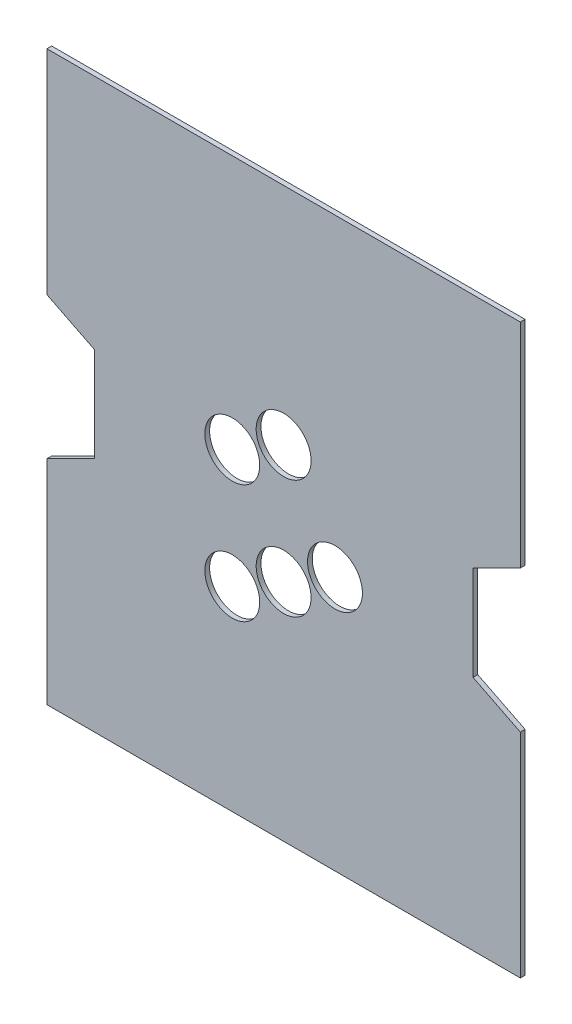
ISO-10303-21;
HEADER;
FILE_DESCRIPTION(('STEP AP214'),'2;1');
FILE_NAME('part.step','',(''),(''),'','','');
FILE_SCHEMA(('AUTOMOTIVE_DESIGN { 1 0 10303 214 1 1 1 1 }'));
ENDSEC;
DATA;
#1=APPLICATION_CONTEXT('core data for automotive mechanical design processes');
#2=APPLICATION_PROTOCOL_DEFINITION('international standard','automotive_design',2000,#1);
#3=PRODUCT_CONTEXT('',#1,'mechanical');
#4=PRODUCT('Part','Part','',(#3));
#5=PRODUCT_RELATED_PRODUCT_CATEGORY('part','',(#4));
#6=PRODUCT_DEFINITION_FORMATION('','',#4);
#7=PRODUCT_DEFINITION_CONTEXT('part definition',#1,'design');
#8=PRODUCT_DEFINITION('design','',#6,#7);
#9=PRODUCT_DEFINITION_SHAPE('','',#8);
#10=(LENGTH_UNIT() NAMED_UNIT(*) SI_UNIT(.MILLI.,.METRE.));
#11=(NAMED_UNIT(*) PLANE_ANGLE_UNIT() SI_UNIT($,.RADIAN.));
#12=(NAMED_UNIT(*) SI_UNIT($,.STERADIAN.) SOLID_ANGLE_UNIT());
#13=UNCERTAINTY_MEASURE_WITH_UNIT(LENGTH_MEASURE(1.E-05),#10,'distance_accuracy_value','');
#14=(GEOMETRIC_REPRESENTATION_CONTEXT(3) GLOBAL_UNCERTAINTY_ASSIGNED_CONTEXT((#13)) GLOBAL_UNIT_ASSIGNED_CONTEXT((#10,
#11,#12)) REPRESENTATION_CONTEXT('',''));
#15=CARTESIAN_POINT('',(0.,0.,0.));
#16=DIRECTION('',(0.,0.,1.));
#17=DIRECTION('',(1.,0.,0.));
#18=AXIS2_PLACEMENT_3D('',#15,#16,#17);
#19=CARTESIAN_POINT('',(0.,0.,0.));
#20=DIRECTION('',(0.,0.,1.));
#21=DIRECTION('',(1.,0.,0.));
#22=AXIS2_PLACEMENT_3D('',#19,#20,#21);
#23=PLANE('',#22);
#24=DIRECTION('',(-0.894427190999915,0.447213595499959,0.));
#25=VECTOR('',#24,1.);
#26=CARTESIAN_POINT('',(20.0000000000002,40.0000000000003,0.));
#27=LINE('',#26,#25);
#28=CARTESIAN_POINT('',(250.,-75.0000000000001,0.));
#29=VERTEX_POINT('',#28);
#30=CARTESIAN_POINT('',(200.,-49.9999999999999,0.));
#31=VERTEX_POINT('',#30);
#32=EDGE_CURVE('E395',#29,#31,#27,.T.);
#33=ORIENTED_EDGE('',*,*,#32,.F.);
#34=DIRECTION('',(0.,1.,0.));
#35=VECTOR('',#34,1.);
#36=CARTESIAN_POINT('',(250.,0.,0.));
#37=LINE('',#36,#35);
#38=CARTESIAN_POINT('',(250.,-300.,0.));
#39=VERTEX_POINT('',#38);
#40=EDGE_CURVE('E397',#29,#39,#37,.F.);
#41=ORIENTED_EDGE('',*,*,#40,.T.);
#42=DIRECTION('',(1.,0.,0.));
#43=VECTOR('',#42,1.);
#44=CARTESIAN_POINT('',(0.,-300.,0.));
#45=LINE('',#44,#43);
#46=CARTESIAN_POINT('',(-250.,-300.,0.));
#47=VERTEX_POINT('',#46);
#48=EDGE_CURVE('E405',#47,#39,#45,.T.);
#49=ORIENTED_EDGE('',*,*,#48,.F.);
#50=DIRECTION('',(0.,1.,0.));
#51=VECTOR('',#50,1.);
#52=CARTESIAN_POINT('',(-250.,0.,0.));
#53=LINE('',#52,#51);
#54=CARTESIAN_POINT('',(-250.,-75.0000000000003,0.));
#55=VERTEX_POINT('',#54);
#56=EDGE_CURVE('E410',#55,#47,#53,.F.);
#57=ORIENTED_EDGE('',*,*,#56,.F.);
#58=DIRECTION('',(0.894427190999915,0.44721359549996,0.));
#59=VECTOR('',#58,1.);
#60=CARTESIAN_POINT('',(-20.0000000000003,40.0000000000004,0.));
#61=LINE('',#60,#59);
#62=CARTESIAN_POINT('',(-200.,-50.,0.));
#63=VERTEX_POINT('',#62);
#64=EDGE_CURVE('E413',#55,#63,#61,.T.);
#65=ORIENTED_EDGE('',*,*,#64,.T.);
#66=DIRECTION('',(0.,-1.,0.));
#67=VECTOR('',#66,1.);
#68=CARTESIAN_POINT('',(-200.,-2.22044604925031E-13,0.));
#69=LINE('',#68,#67);
#70=CARTESIAN_POINT('',(-200.,50.,0.));
#71=VERTEX_POINT('',#70);
#72=EDGE_CURVE('E421',#71,#63,#69,.T.);
#73=ORIENTED_EDGE('',*,*,#72,.F.);
#74=DIRECTION('',(0.894427190999916,-0.447213595499958,0.));
#75=VECTOR('',#74,1.);
#76=CARTESIAN_POINT('',(-20.,-40.,0.));
#77=LINE('',#76,#75);
#78=CARTESIAN_POINT('',(-250.,75.,0.));
#79=VERTEX_POINT('',#78);
#80=EDGE_CURVE('E426',#79,#71,#77,.T.);
#81=ORIENTED_EDGE('',*,*,#80,.F.);
#82=DIRECTION('',(0.,1.,0.));
#83=VECTOR('',#82,1.);
#84=CARTESIAN_POINT('',(-250.,0.,0.));
#85=LINE('',#84,#83);
#86=CARTESIAN_POINT('',(-250.,300.,0.));
#87=VERTEX_POINT('',#86);
#88=EDGE_CURVE('E430',#87,#79,#85,.F.);
#89=ORIENTED_EDGE('',*,*,#88,.F.);
#90=DIRECTION('',(1.,0.,0.));
#91=VECTOR('',#90,1.);
#92=CARTESIAN_POINT('',(0.,300.,0.));
#93=LINE('',#92,#91);
#94=CARTESIAN_POINT('',(250.,300.,0.));
#95=VERTEX_POINT('',#94);
#96=EDGE_CURVE('E378',#87,#95,#93,.T.);
#97=ORIENTED_EDGE('',*,*,#96,.T.);
#98=DIRECTION('',(0.,1.,0.));
#99=VECTOR('',#98,1.);
#100=CARTESIAN_POINT('',(250.,0.,0.));
#101=LINE('',#100,#99);
#102=CARTESIAN_POINT('',(250.,75.,0.));
#103=VERTEX_POINT('',#102);
#104=EDGE_CURVE('E120',#95,#103,#101,.F.);
#105=ORIENTED_EDGE('',*,*,#104,.T.);
#106=DIRECTION('',(-0.894427190999916,-0.447213595499958,0.));
#107=VECTOR('',#106,1.);
#108=CARTESIAN_POINT('',(20.,-40.,0.));
#109=LINE('',#108,#107);
#110=CARTESIAN_POINT('',(200.,50.,0.));
#111=VERTEX_POINT('',#110);
#112=EDGE_CURVE('E103',#103,#111,#109,.T.);
#113=ORIENTED_EDGE('',*,*,#112,.T.);
#114=DIRECTION('',(0.,-1.,0.));
#115=VECTOR('',#114,1.);
#116=CARTESIAN_POINT('',(200.,-2.22044604925031E-13,0.));
#117=LINE('',#116,#115);
#118=EDGE_CURVE('E108',#111,#31,#117,.T.);
#119=ORIENTED_EDGE('',*,*,#118,.T.);
#120=EDGE_LOOP('',(#33,#41,#49,#57,#65,#73,#81,#89,#97,#105,#113,#119));
#121=FACE_BOUND('',#120,.T.);
#122=CARTESIAN_POINT('',(-54.2270338553597,-93.927023337783,0.));
#123=DIRECTION('',(0.,0.,1.));
#124=DIRECTION('',(1.,0.,0.));
#125=AXIS2_PLACEMENT_3D('',#122,#123,#124);
#126=CIRCLE('',#125,29.);
#127=CARTESIAN_POINT('',(-25.2270338553597,-93.927023337783,0.));
#128=VERTEX_POINT('',#127);
#129=EDGE_CURVE('E116',#128,#128,#126,.T.);
#130=ORIENTED_EDGE('',*,*,#129,.T.);
#131=EDGE_LOOP('',(#130));
#132=FACE_BOUND('',#131,.T.);
#133=CARTESIAN_POINT('',(0.0024587905189926,-62.6152599353402,0.));
#134=DIRECTION('',(0.,0.,1.));
#135=DIRECTION('',(1.,0.,0.));
#136=AXIS2_PLACEMENT_3D('',#133,#134,#135);
#137=CIRCLE('',#136,29.);
#138=CARTESIAN_POINT('',(29.002458790519,-62.6152599353402,0.));
#139=VERTEX_POINT('',#138);
#140=EDGE_CURVE('E149',#139,#139,#137,.T.);
#141=ORIENTED_EDGE('',*,*,#140,.T.);
#142=EDGE_LOOP('',(#141));
#143=FACE_BOUND('',#142,.T.);
#144=CARTESIAN_POINT('',(54.2329781373971,-31.3040892544827,0.));
#145=DIRECTION('',(0.,0.,1.));
#146=DIRECTION('',(1.,0.,0.));
#147=AXIS2_PLACEMENT_3D('',#144,#145,#146);
#148=CIRCLE('',#147,29.);
#149=CARTESIAN_POINT('',(83.2329781373971,-31.3040892544827,0.));
#150=VERTEX_POINT('',#149);
#151=EDGE_CURVE('E152',#150,#150,#148,.T.);
#152=ORIENTED_EDGE('',*,*,#151,.T.);
#153=EDGE_LOOP('',(#152));
#154=FACE_BOUND('',#153,.T.);
#155=CARTESIAN_POINT('',(-54.2311062970869,31.312976596005,0.));
#156=DIRECTION('',(0.,0.,1.));
#157=DIRECTION('',(1.,0.,0.));
#158=AXIS2_PLACEMENT_3D('',#155,#156,#157);
#159=CIRCLE('',#158,29.);
#160=CARTESIAN_POINT('',(-25.2311062970869,31.312976596005,0.));
#161=VERTEX_POINT('',#160);
#162=EDGE_CURVE('E154',#161,#161,#159,.T.);
#163=ORIENTED_EDGE('',*,*,#162,.T.);
#164=EDGE_LOOP('',(#163));
#165=FACE_BOUND('',#164,.T.);
#166=CARTESIAN_POINT('',(-0.00161365120862089,62.6247399984478,0.));
#167=DIRECTION('',(0.,0.,1.));
#168=DIRECTION('',(1.,0.,0.));
#169=AXIS2_PLACEMENT_3D('',#166,#167,#168);
#170=CIRCLE('',#169,29.);
#171=CARTESIAN_POINT('',(28.9983863487914,62.6247399984478,0.));
#172=VERTEX_POINT('',#171);
#173=EDGE_CURVE('E19',#172,#172,#170,.T.);
#174=ORIENTED_EDGE('',*,*,#173,.T.);
#175=EDGE_LOOP('',(#174));
#176=FACE_BOUND('',#175,.T.);
#177=ADVANCED_FACE('F16',(#121,#132,#143,#154,#165,#176),#23,.F.);
#178=CARTESIAN_POINT('',(-0.00161365120862089,62.6247399984478,0.));
#179=DIRECTION('',(0.,0.,1.));
#180=DIRECTION('',(1.,0.,0.));
#181=AXIS2_PLACEMENT_3D('',#178,#179,#180);
#182=CYLINDRICAL_SURFACE('',#181,29.);
#183=CARTESIAN_POINT('',(-0.00161365120862089,62.6247399984478,5.));
#184=DIRECTION('',(0.,0.,1.));
#185=DIRECTION('',(1.,0.,0.));
#186=AXIS2_PLACEMENT_3D('',#183,#184,#185);
#187=CIRCLE('',#186,29.);
#188=CARTESIAN_POINT('',(28.9983863487914,62.6247399984478,5.));
#189=VERTEX_POINT('',#188);
#190=EDGE_CURVE('E144',#189,#189,#187,.F.);
#191=ORIENTED_EDGE('',*,*,#190,.F.);
#192=EDGE_LOOP('',(#191));
#193=FACE_BOUND('',#192,.T.);
#194=ORIENTED_EDGE('',*,*,#173,.F.);
#195=EDGE_LOOP('',(#194));
#196=FACE_BOUND('',#195,.T.);
#197=ADVANCED_FACE('F162',(#193,#196),#182,.F.);
#198=CARTESIAN_POINT('',(-54.2311062970869,31.312976596005,0.));
#199=DIRECTION('',(0.,0.,1.));
#200=DIRECTION('',(1.,0.,0.));
#201=AXIS2_PLACEMENT_3D('',#198,#199,#200);
#202=CYLINDRICAL_SURFACE('',#201,29.);
#203=CARTESIAN_POINT('',(-54.2311062970869,31.312976596005,5.));
#204=DIRECTION('',(0.,0.,1.));
#205=DIRECTION('',(1.,0.,0.));
#206=AXIS2_PLACEMENT_3D('',#203,#204,#205);
#207=CIRCLE('',#206,29.);
#208=CARTESIAN_POINT('',(-25.2311062970869,31.312976596005,5.));
#209=VERTEX_POINT('',#208);
#210=EDGE_CURVE('E141',#209,#209,#207,.F.);
#211=ORIENTED_EDGE('',*,*,#210,.F.);
#212=EDGE_LOOP('',(#211));
#213=FACE_BOUND('',#212,.T.);
#214=ORIENTED_EDGE('',*,*,#162,.F.);
#215=EDGE_LOOP('',(#214));
#216=FACE_BOUND('',#215,.T.);
#217=ADVANCED_FACE('F164',(#213,#216),#202,.F.);
#218=CARTESIAN_POINT('',(54.2329781373971,-31.3040892544827,0.));
#219=DIRECTION('',(0.,0.,1.));
#220=DIRECTION('',(1.,0.,0.));
#221=AXIS2_PLACEMENT_3D('',#218,#219,#220);
#222=CYLINDRICAL_SURFACE('',#221,29.);
#223=CARTESIAN_POINT('',(54.2329781373971,-31.3040892544827,5.));
#224=DIRECTION('',(0.,0.,1.));
#225=DIRECTION('',(1.,0.,0.));
#226=AXIS2_PLACEMENT_3D('',#223,#224,#225);
#227=CIRCLE('',#226,29.);
#228=CARTESIAN_POINT('',(83.2329781373971,-31.3040892544827,5.));
#229=VERTEX_POINT('',#228);
#230=EDGE_CURVE('E138',#229,#229,#227,.F.);
#231=ORIENTED_EDGE('',*,*,#230,.F.);
#232=EDGE_LOOP('',(#231));
#233=FACE_BOUND('',#232,.T.);
#234=ORIENTED_EDGE('',*,*,#151,.F.);
#235=EDGE_LOOP('',(#234));
#236=FACE_BOUND('',#235,.T.);
#237=ADVANCED_FACE('F171',(#233,#236),#222,.F.);
#238=CARTESIAN_POINT('',(0.0024587905189926,-62.6152599353402,0.));
#239=DIRECTION('',(0.,0.,1.));
#240=DIRECTION('',(1.,0.,0.));
#241=AXIS2_PLACEMENT_3D('',#238,#239,#240);
#242=CYLINDRICAL_SURFACE('',#241,29.);
#243=CARTESIAN_POINT('',(0.0024587905189926,-62.6152599353402,5.));
#244=DIRECTION('',(0.,0.,1.));
#245=DIRECTION('',(1.,0.,0.));
#246=AXIS2_PLACEMENT_3D('',#243,#244,#245);
#247=CIRCLE('',#246,29.);
#248=CARTESIAN_POINT('',(29.002458790519,-62.6152599353402,5.));
#249=VERTEX_POINT('',#248);
#250=EDGE_CURVE('E135',#249,#249,#247,.F.);
#251=ORIENTED_EDGE('',*,*,#250,.F.);
#252=EDGE_LOOP('',(#251));
#253=FACE_BOUND('',#252,.T.);
#254=ORIENTED_EDGE('',*,*,#140,.F.);
#255=EDGE_LOOP('',(#254));
#256=FACE_BOUND('',#255,.T.);
#257=ADVANCED_FACE('F230',(#253,#256),#242,.F.);
#258=CARTESIAN_POINT('',(-54.2270338553597,-93.927023337783,0.));
#259=DIRECTION('',(0.,0.,1.));
#260=DIRECTION('',(1.,0.,0.));
#261=AXIS2_PLACEMENT_3D('',#258,#259,#260);
#262=CYLINDRICAL_SURFACE('',#261,29.);
#263=CARTESIAN_POINT('',(-54.2270338553597,-93.927023337783,5.));
#264=DIRECTION('',(0.,0.,1.));
#265=DIRECTION('',(1.,0.,0.));
#266=AXIS2_PLACEMENT_3D('',#263,#264,#265);
#267=CIRCLE('',#266,29.);
#268=CARTESIAN_POINT('',(-25.2270338553597,-93.927023337783,5.));
#269=VERTEX_POINT('',#268);
#270=EDGE_CURVE('E131',#269,#269,#267,.F.);
#271=ORIENTED_EDGE('',*,*,#270,.F.);
#272=EDGE_LOOP('',(#271));
#273=FACE_BOUND('',#272,.T.);
#274=ORIENTED_EDGE('',*,*,#129,.F.);
#275=EDGE_LOOP('',(#274));
#276=FACE_BOUND('',#275,.T.);
#277=ADVANCED_FACE('F227',(#273,#276),#262,.F.);
#278=CARTESIAN_POINT('',(200.,-2.22044604925031E-13,5.));
#279=DIRECTION('',(-1.,0.,0.));
#280=DIRECTION('',(0.,-1.,0.));
#281=AXIS2_PLACEMENT_3D('',#278,#279,#280);
#282=PLANE('',#281);
#283=DIRECTION('',(0.,0.,1.));
#284=VECTOR('',#283,1.);
#285=CARTESIAN_POINT('',(200.,50.,5.));
#286=LINE('',#285,#284);
#287=CARTESIAN_POINT('',(200.,50.,5.));
#288=VERTEX_POINT('',#287);
#289=EDGE_CURVE('E110',#111,#288,#286,.T.);
#290=ORIENTED_EDGE('',*,*,#289,.T.);
#291=DIRECTION('',(0.,1.,0.));
#292=VECTOR('',#291,1.);
#293=CARTESIAN_POINT('',(200.,0.,5.));
#294=LINE('',#293,#292);
#295=CARTESIAN_POINT('',(200.,-49.9999999999999,5.));
#296=VERTEX_POINT('',#295);
#297=EDGE_CURVE('E134',#296,#288,#294,.T.);
#298=ORIENTED_EDGE('',*,*,#297,.F.);
#299=DIRECTION('',(0.,0.,1.));
#300=VECTOR('',#299,1.);
#301=CARTESIAN_POINT('',(200.,-49.9999999999999,5.));
#302=LINE('',#301,#300);
#303=EDGE_CURVE('E113',#31,#296,#302,.T.);
#304=ORIENTED_EDGE('',*,*,#303,.F.);
#305=ORIENTED_EDGE('',*,*,#118,.F.);
#306=EDGE_LOOP('',(#290,#298,#304,#305));
#307=FACE_BOUND('',#306,.T.);
#308=ADVANCED_FACE('F109',(#307),#282,.F.);
#309=CARTESIAN_POINT('',(20.,-40.,5.));
#310=DIRECTION('',(-0.447213595499958,0.894427190999916,0.));
#311=DIRECTION('',(-0.894427190999916,-0.447213595499958,0.));
#312=AXIS2_PLACEMENT_3D('',#309,#310,#311);
#313=PLANE('',#312);
#314=DIRECTION('',(0.,0.,1.));
#315=VECTOR('',#314,1.);
#316=CARTESIAN_POINT('',(250.,75.,5.));
#317=LINE('',#316,#315);
#318=CARTESIAN_POINT('',(250.,75.,5.));
#319=VERTEX_POINT('',#318);
#320=EDGE_CURVE('E122',#103,#319,#317,.T.);
#321=ORIENTED_EDGE('',*,*,#320,.T.);
#322=DIRECTION('',(0.894427190999916,0.447213595499958,0.));
#323=VECTOR('',#322,1.);
#324=CARTESIAN_POINT('',(200.,50.,5.));
#325=LINE('',#324,#323);
#326=EDGE_CURVE('E126',#288,#319,#325,.T.);
#327=ORIENTED_EDGE('',*,*,#326,.F.);
#328=ORIENTED_EDGE('',*,*,#289,.F.);
#329=ORIENTED_EDGE('',*,*,#112,.F.);
#330=EDGE_LOOP('',(#321,#327,#328,#329));
#331=FACE_BOUND('',#330,.T.);
#332=ADVANCED_FACE('F124',(#331),#313,.F.);
#333=CARTESIAN_POINT('',(250.,0.,5.));
#334=DIRECTION('',(-1.,0.,0.));
#335=DIRECTION('',(0.,0.,1.));
#336=AXIS2_PLACEMENT_3D('',#333,#334,#335);
#337=PLANE('',#336);
#338=DIRECTION('',(0.,0.,-1.));
#339=VECTOR('',#338,1.);
#340=CARTESIAN_POINT('',(250.,300.,5.));
#341=LINE('',#340,#339);
#342=CARTESIAN_POINT('',(250.,300.,5.));
#343=VERTEX_POINT('',#342);
#344=EDGE_CURVE('E373',#95,#343,#341,.F.);
#345=ORIENTED_EDGE('',*,*,#344,.T.);
#346=DIRECTION('',(0.,1.,0.));
#347=VECTOR('',#346,1.);
#348=CARTESIAN_POINT('',(250.,0.,5.));
#349=LINE('',#348,#347);
#350=EDGE_CURVE('E376',#319,#343,#349,.T.);
#351=ORIENTED_EDGE('',*,*,#350,.F.);
#352=ORIENTED_EDGE('',*,*,#320,.F.);
#353=ORIENTED_EDGE('',*,*,#104,.F.);
#354=EDGE_LOOP('',(#345,#351,#352,#353));
#355=FACE_BOUND('',#354,.T.);
#356=ADVANCED_FACE('F218',(#355),#337,.F.);
#357=CARTESIAN_POINT('',(0.,300.,5.));
#358=DIRECTION('',(0.,-1.,0.));
#359=DIRECTION('',(0.,0.,-1.));
#360=AXIS2_PLACEMENT_3D('',#357,#358,#359);
#361=PLANE('',#360);
#362=DIRECTION('',(0.,0.,1.));
#363=VECTOR('',#362,1.);
#364=CARTESIAN_POINT('',(-250.,300.,5.));
#365=LINE('',#364,#363);
#366=CARTESIAN_POINT('',(-250.,300.,5.));
#367=VERTEX_POINT('',#366);
#368=EDGE_CURVE('E383',#367,#87,#365,.F.);
#369=ORIENTED_EDGE('',*,*,#368,.F.);
#370=DIRECTION('',(1.,0.,0.));
#371=VECTOR('',#370,1.);
#372=CARTESIAN_POINT('',(0.,300.,5.));
#373=LINE('',#372,#371);
#374=EDGE_CURVE('E381',#343,#367,#373,.F.);
#375=ORIENTED_EDGE('',*,*,#374,.F.);
#376=ORIENTED_EDGE('',*,*,#344,.F.);
#377=ORIENTED_EDGE('',*,*,#96,.F.);
#378=EDGE_LOOP('',(#369,#375,#376,#377));
#379=FACE_BOUND('',#378,.T.);
#380=ADVANCED_FACE('F214',(#379),#361,.F.);
#381=CARTESIAN_POINT('',(-250.,0.,5.));
#382=DIRECTION('',(-1.,0.,0.));
#383=DIRECTION('',(0.,0.,1.));
#384=AXIS2_PLACEMENT_3D('',#381,#382,#383);
#385=PLANE('',#384);
#386=DIRECTION('',(0.,1.,0.));
#387=VECTOR('',#386,1.);
#388=CARTESIAN_POINT('',(-250.,0.,5.));
#389=LINE('',#388,#387);
#390=CARTESIAN_POINT('',(-250.,75.,5.));
#391=VERTEX_POINT('',#390);
#392=EDGE_CURVE('E386',#367,#391,#389,.F.);
#393=ORIENTED_EDGE('',*,*,#392,.F.);
#394=ORIENTED_EDGE('',*,*,#368,.T.);
#395=ORIENTED_EDGE('',*,*,#88,.T.);
#396=DIRECTION('',(0.,0.,1.));
#397=VECTOR('',#396,1.);
#398=CARTESIAN_POINT('',(-250.,75.,5.));
#399=LINE('',#398,#397);
#400=EDGE_CURVE('E423',#391,#79,#399,.F.);
#401=ORIENTED_EDGE('',*,*,#400,.F.);
#402=EDGE_LOOP('',(#393,#394,#395,#401));
#403=FACE_BOUND('',#402,.T.);
#404=ADVANCED_FACE('F210',(#403),#385,.T.);
#405=CARTESIAN_POINT('',(-20.,-40.,5.));
#406=DIRECTION('',(-0.447213595499958,-0.894427190999916,0.));
#407=DIRECTION('',(0.894427190999916,-0.447213595499958,0.));
#408=AXIS2_PLACEMENT_3D('',#405,#406,#407);
#409=PLANE('',#408);
#410=DIRECTION('',(0.894427190999916,-0.447213595499958,0.));
#411=VECTOR('',#410,1.);
#412=CARTESIAN_POINT('',(-250.,75.,5.));
#413=LINE('',#412,#411);
#414=CARTESIAN_POINT('',(-200.,50.,5.));
#415=VERTEX_POINT('',#414);
#416=EDGE_CURVE('E436',#391,#415,#413,.T.);
#417=ORIENTED_EDGE('',*,*,#416,.F.);
#418=ORIENTED_EDGE('',*,*,#400,.T.);
#419=ORIENTED_EDGE('',*,*,#80,.T.);
#420=DIRECTION('',(0.,0.,1.));
#421=VECTOR('',#420,1.);
#422=CARTESIAN_POINT('',(-200.,50.,5.));
#423=LINE('',#422,#421);
#424=EDGE_CURVE('E418',#415,#71,#423,.F.);
#425=ORIENTED_EDGE('',*,*,#424,.F.);
#426=EDGE_LOOP('',(#417,#418,#419,#425));
#427=FACE_BOUND('',#426,.T.);
#428=ADVANCED_FACE('F206',(#427),#409,.T.);
#429=CARTESIAN_POINT('',(-200.,-2.22044604925031E-13,5.));
#430=DIRECTION('',(-1.,0.,0.));
#431=DIRECTION('',(0.,-1.,0.));
#432=AXIS2_PLACEMENT_3D('',#429,#430,#431);
#433=PLANE('',#432);
#434=DIRECTION('',(0.,1.,0.));
#435=VECTOR('',#434,1.);
#436=CARTESIAN_POINT('',(-200.,0.,5.));
#437=LINE('',#436,#435);
#438=CARTESIAN_POINT('',(-200.,-50.,5.));
#439=VERTEX_POINT('',#438);
#440=EDGE_CURVE('E437',#415,#439,#437,.F.);
#441=ORIENTED_EDGE('',*,*,#440,.F.);
#442=ORIENTED_EDGE('',*,*,#424,.T.);
#443=ORIENTED_EDGE('',*,*,#72,.T.);
#444=DIRECTION('',(0.,0.,1.));
#445=VECTOR('',#444,1.);
#446=CARTESIAN_POINT('',(-200.,-50.,5.));
#447=LINE('',#446,#445);
#448=EDGE_CURVE('E416',#63,#439,#447,.T.);
#449=ORIENTED_EDGE('',*,*,#448,.T.);
#450=EDGE_LOOP('',(#441,#442,#443,#449));
#451=FACE_BOUND('',#450,.T.);
#452=ADVANCED_FACE('F202',(#451),#433,.T.);
#453=CARTESIAN_POINT('',(-20.0000000000003,40.0000000000004,5.));
#454=DIRECTION('',(0.44721359549996,-0.894427190999915,0.));
#455=DIRECTION('',(0.894427190999915,0.44721359549996,0.));
#456=AXIS2_PLACEMENT_3D('',#453,#454,#455);
#457=PLANE('',#456);
#458=DIRECTION('',(0.,0.,1.));
#459=VECTOR('',#458,1.);
#460=CARTESIAN_POINT('',(-250.,-75.0000000000002,5.));
#461=LINE('',#460,#459);
#462=CARTESIAN_POINT('',(-250.,-75.0000000000003,5.));
#463=VERTEX_POINT('',#462);
#464=EDGE_CURVE('E407',#463,#55,#461,.F.);
#465=ORIENTED_EDGE('',*,*,#464,.F.);
#466=DIRECTION('',(-0.894427190999915,-0.44721359549996,0.));
#467=VECTOR('',#466,1.);
#468=CARTESIAN_POINT('',(-200.,-50.,5.));
#469=LINE('',#468,#467);
#470=EDGE_CURVE('E442',#439,#463,#469,.T.);
#471=ORIENTED_EDGE('',*,*,#470,.F.);
#472=ORIENTED_EDGE('',*,*,#448,.F.);
#473=ORIENTED_EDGE('',*,*,#64,.F.);
#474=EDGE_LOOP('',(#465,#471,#472,#473));
#475=FACE_BOUND('',#474,.T.);
#476=ADVANCED_FACE('F198',(#475),#457,.F.);
#477=CARTESIAN_POINT('',(-250.,0.,5.));
#478=DIRECTION('',(-1.,0.,0.));
#479=DIRECTION('',(0.,0.,1.));
#480=AXIS2_PLACEMENT_3D('',#477,#478,#479);
#481=PLANE('',#480);
#482=DIRECTION('',(0.,1.,0.));
#483=VECTOR('',#482,1.);
#484=CARTESIAN_POINT('',(-250.,0.,5.));
#485=LINE('',#484,#483);
#486=CARTESIAN_POINT('',(-250.,-300.,5.));
#487=VERTEX_POINT('',#486);
#488=EDGE_CURVE('E445',#463,#487,#485,.F.);
#489=ORIENTED_EDGE('',*,*,#488,.F.);
#490=ORIENTED_EDGE('',*,*,#464,.T.);
#491=ORIENTED_EDGE('',*,*,#56,.T.);
#492=DIRECTION('',(0.,0.,1.));
#493=VECTOR('',#492,1.);
#494=CARTESIAN_POINT('',(-250.,-300.,5.));
#495=LINE('',#494,#493);
#496=EDGE_CURVE('E402',#487,#47,#495,.F.);
#497=ORIENTED_EDGE('',*,*,#496,.F.);
#498=EDGE_LOOP('',(#489,#490,#491,#497));
#499=FACE_BOUND('',#498,.T.);
#500=ADVANCED_FACE('F194',(#499),#481,.T.);
#501=CARTESIAN_POINT('',(0.,-300.,5.));
#502=DIRECTION('',(0.,-1.,0.));
#503=DIRECTION('',(1.,0.,0.));
#504=AXIS2_PLACEMENT_3D('',#501,#502,#503);
#505=PLANE('',#504);
#506=DIRECTION('',(1.,0.,0.));
#507=VECTOR('',#506,1.);
#508=CARTESIAN_POINT('',(0.,-300.,5.));
#509=LINE('',#508,#507);
#510=CARTESIAN_POINT('',(250.,-300.,5.));
#511=VERTEX_POINT('',#510);
#512=EDGE_CURVE('E448',#487,#511,#509,.T.);
#513=ORIENTED_EDGE('',*,*,#512,.F.);
#514=ORIENTED_EDGE('',*,*,#496,.T.);
#515=ORIENTED_EDGE('',*,*,#48,.T.);
#516=DIRECTION('',(0.,0.,1.));
#517=VECTOR('',#516,1.);
#518=CARTESIAN_POINT('',(250.,-300.,5.));
#519=LINE('',#518,#517);
#520=EDGE_CURVE('E400',#39,#511,#519,.T.);
#521=ORIENTED_EDGE('',*,*,#520,.T.);
#522=EDGE_LOOP('',(#513,#514,#515,#521));
#523=FACE_BOUND('',#522,.T.);
#524=ADVANCED_FACE('F191',(#523),#505,.T.);
#525=CARTESIAN_POINT('',(250.,0.,5.));
#526=DIRECTION('',(-1.,0.,0.));
#527=DIRECTION('',(0.,0.,1.));
#528=AXIS2_PLACEMENT_3D('',#525,#526,#527);
#529=PLANE('',#528);
#530=DIRECTION('',(0.,0.,1.));
#531=VECTOR('',#530,1.);
#532=CARTESIAN_POINT('',(250.,-75.0000000000001,5.));
#533=LINE('',#532,#531);
#534=CARTESIAN_POINT('',(250.,-75.0000000000001,5.));
#535=VERTEX_POINT('',#534);
#536=EDGE_CURVE('E34',#535,#29,#533,.F.);
#537=ORIENTED_EDGE('',*,*,#536,.F.);
#538=DIRECTION('',(0.,1.,0.));
#539=VECTOR('',#538,1.);
#540=CARTESIAN_POINT('',(250.,0.,5.));
#541=LINE('',#540,#539);
#542=EDGE_CURVE('E25',#511,#535,#541,.T.);
#543=ORIENTED_EDGE('',*,*,#542,.F.);
#544=ORIENTED_EDGE('',*,*,#520,.F.);
#545=ORIENTED_EDGE('',*,*,#40,.F.);
#546=EDGE_LOOP('',(#537,#543,#544,#545));
#547=FACE_BOUND('',#546,.T.);
#548=ADVANCED_FACE('F183',(#547),#529,.F.);
#549=CARTESIAN_POINT('',(20.0000000000002,40.0000000000003,5.));
#550=DIRECTION('',(0.447213595499959,0.894427190999915,0.));
#551=DIRECTION('',(-0.894427190999915,0.447213595499959,0.));
#552=AXIS2_PLACEMENT_3D('',#549,#550,#551);
#553=PLANE('',#552);
#554=DIRECTION('',(-0.894427190999915,0.447213595499959,0.));
#555=VECTOR('',#554,1.);
#556=CARTESIAN_POINT('',(250.,-75.0000000000001,5.));
#557=LINE('',#556,#555);
#558=EDGE_CURVE('E10',#535,#296,#557,.T.);
#559=ORIENTED_EDGE('',*,*,#558,.F.);
#560=ORIENTED_EDGE('',*,*,#536,.T.);
#561=ORIENTED_EDGE('',*,*,#32,.T.);
#562=ORIENTED_EDGE('',*,*,#303,.T.);
#563=EDGE_LOOP('',(#559,#560,#561,#562));
#564=FACE_BOUND('',#563,.T.);
#565=ADVANCED_FACE('F177',(#564),#553,.T.);
#566=CARTESIAN_POINT('',(0.,0.,5.));
#567=DIRECTION('',(0.,0.,1.));
#568=DIRECTION('',(1.,0.,0.));
#569=AXIS2_PLACEMENT_3D('',#566,#567,#568);
#570=PLANE('',#569);
#571=ORIENTED_EDGE('',*,*,#542,.T.);
#572=ORIENTED_EDGE('',*,*,#558,.T.);
#573=ORIENTED_EDGE('',*,*,#297,.T.);
#574=ORIENTED_EDGE('',*,*,#326,.T.);
#575=ORIENTED_EDGE('',*,*,#350,.T.);
#576=ORIENTED_EDGE('',*,*,#374,.T.);
#577=ORIENTED_EDGE('',*,*,#392,.T.);
#578=ORIENTED_EDGE('',*,*,#416,.T.);
#579=ORIENTED_EDGE('',*,*,#440,.T.);
#580=ORIENTED_EDGE('',*,*,#470,.T.);
#581=ORIENTED_EDGE('',*,*,#488,.T.);
#582=ORIENTED_EDGE('',*,*,#512,.T.);
#583=EDGE_LOOP('',(#571,#572,#573,#574,#575,#576,#577,#578,#579,#580,#581,#582));
#584=FACE_BOUND('',#583,.T.);
#585=ORIENTED_EDGE('',*,*,#270,.T.);
#586=EDGE_LOOP('',(#585));
#587=FACE_BOUND('',#586,.T.);
#588=ORIENTED_EDGE('',*,*,#250,.T.);
#589=EDGE_LOOP('',(#588));
#590=FACE_BOUND('',#589,.T.);
#591=ORIENTED_EDGE('',*,*,#230,.T.);
#592=EDGE_LOOP('',(#591));
#593=FACE_BOUND('',#592,.T.);
#594=ORIENTED_EDGE('',*,*,#210,.T.);
#595=EDGE_LOOP('',(#594));
#596=FACE_BOUND('',#595,.T.);
#597=ORIENTED_EDGE('',*,*,#190,.T.);
#598=EDGE_LOOP('',(#597));
#599=FACE_BOUND('',#598,.T.);
#600=ADVANCED_FACE('F175',(#584,#587,#590,#593,#596,#599),#570,.T.);
#601=CLOSED_SHELL('',(#177,#197,#217,#237,#257,#277,#308,#332,#356,#380,#404,#428,#452,#476,
#500,#524,#548,#565,#600));
#602=MANIFOLD_SOLID_BREP('B1',#601);
#603=ADVANCED_BREP_SHAPE_REPRESENTATION('',(#18,#602),#14);
#604=SHAPE_DEFINITION_REPRESENTATION(#9,#603);
ENDSEC;
END-ISO-10303-21;
